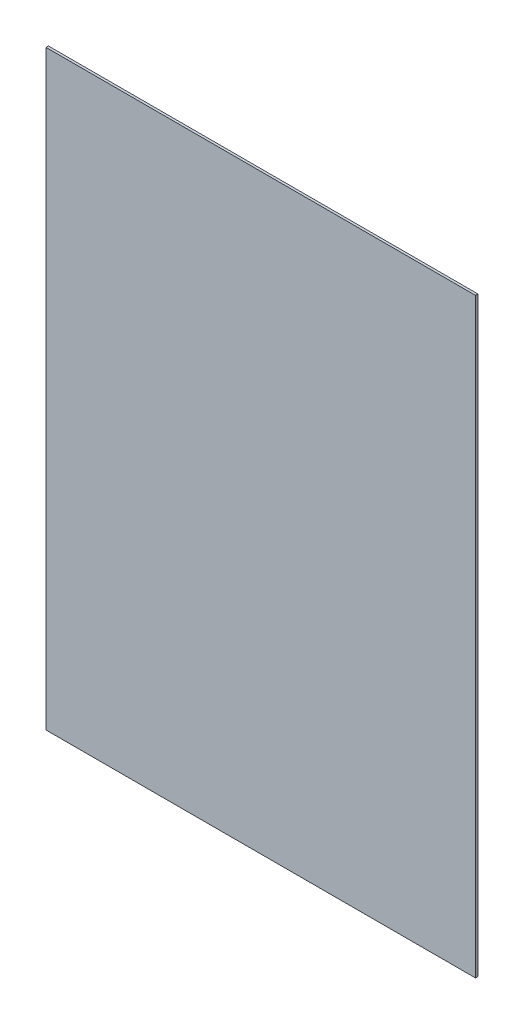
ISO-10303-21;
HEADER;
FILE_DESCRIPTION(('STEP AP214'),'2;1');
FILE_NAME('part.step','',(''),(''),'','','');
FILE_SCHEMA(('AUTOMOTIVE_DESIGN { 1 0 10303 214 1 1 1 1 }'));
ENDSEC;
DATA;
#1=APPLICATION_CONTEXT('core data for automotive mechanical design processes');
#2=APPLICATION_PROTOCOL_DEFINITION('international standard','automotive_design',2000,#1);
#3=PRODUCT_CONTEXT('',#1,'mechanical');
#4=PRODUCT('Part','Part','',(#3));
#5=PRODUCT_RELATED_PRODUCT_CATEGORY('part','',(#4));
#6=PRODUCT_DEFINITION_FORMATION('','',#4);
#7=PRODUCT_DEFINITION_CONTEXT('part definition',#1,'design');
#8=PRODUCT_DEFINITION('design','',#6,#7);
#9=PRODUCT_DEFINITION_SHAPE('','',#8);
#10=(LENGTH_UNIT() NAMED_UNIT(*) SI_UNIT(.MILLI.,.METRE.));
#11=(NAMED_UNIT(*) PLANE_ANGLE_UNIT() SI_UNIT($,.RADIAN.));
#12=(NAMED_UNIT(*) SI_UNIT($,.STERADIAN.) SOLID_ANGLE_UNIT());
#13=UNCERTAINTY_MEASURE_WITH_UNIT(LENGTH_MEASURE(1.E-05),#10,'distance_accuracy_value','');
#14=(GEOMETRIC_REPRESENTATION_CONTEXT(3) GLOBAL_UNCERTAINTY_ASSIGNED_CONTEXT((#13)) GLOBAL_UNIT_ASSIGNED_CONTEXT((#10,
#11,#12)) REPRESENTATION_CONTEXT('',''));
#15=CARTESIAN_POINT('',(0.,0.,0.));
#16=DIRECTION('',(0.,0.,1.));
#17=DIRECTION('',(1.,0.,0.));
#18=AXIS2_PLACEMENT_3D('',#15,#16,#17);
#19=CARTESIAN_POINT('',(134.9375,185.7375,7.74699999999995));
#20=DIRECTION('',(0.,0.,-1.));
#21=DIRECTION('',(-1.,0.,0.));
#22=AXIS2_PLACEMENT_3D('',#19,#20,#21);
#23=PLANE('',#22);
#24=DIRECTION('',(1.,0.,0.));
#25=VECTOR('',#24,1.);
#26=CARTESIAN_POINT('',(-134.9375,-185.7375,7.74699999999995));
#27=LINE('',#26,#25);
#28=CARTESIAN_POINT('',(-134.9375,-185.7375,7.74699999999995));
#29=VERTEX_POINT('',#28);
#30=CARTESIAN_POINT('',(134.9375,-185.7375,7.74699999999995));
#31=VERTEX_POINT('',#30);
#32=EDGE_CURVE('E59',#29,#31,#27,.T.);
#33=ORIENTED_EDGE('',*,*,#32,.F.);
#34=DIRECTION('',(0.,-1.,0.));
#35=VECTOR('',#34,1.);
#36=CARTESIAN_POINT('',(-134.9375,185.7375,7.74699999999995));
#37=LINE('',#36,#35);
#38=CARTESIAN_POINT('',(-134.9375,185.7375,7.74699999999995));
#39=VERTEX_POINT('',#38);
#40=EDGE_CURVE('E54',#39,#29,#37,.T.);
#41=ORIENTED_EDGE('',*,*,#40,.F.);
#42=DIRECTION('',(1.,0.,0.));
#43=VECTOR('',#42,1.);
#44=CARTESIAN_POINT('',(-134.9375,185.7375,7.74699999999995));
#45=LINE('',#44,#43);
#46=CARTESIAN_POINT('',(134.9375,185.7375,7.74699999999995));
#47=VERTEX_POINT('',#46);
#48=EDGE_CURVE('E70',#47,#39,#45,.F.);
#49=ORIENTED_EDGE('',*,*,#48,.F.);
#50=DIRECTION('',(0.,1.,0.));
#51=VECTOR('',#50,1.);
#52=CARTESIAN_POINT('',(134.9375,185.7375,7.74699999999995));
#53=LINE('',#52,#51);
#54=EDGE_CURVE('E20',#31,#47,#53,.T.);
#55=ORIENTED_EDGE('',*,*,#54,.F.);
#56=EDGE_LOOP('',(#33,#41,#49,#55));
#57=FACE_BOUND('',#56,.T.);
#58=ADVANCED_FACE('F17',(#57),#23,.T.);
#59=CARTESIAN_POINT('',(134.9375,185.7375,7.74699999999995));
#60=DIRECTION('',(1.,0.,0.));
#61=DIRECTION('',(0.,1.,0.));
#62=AXIS2_PLACEMENT_3D('',#59,#60,#61);
#63=PLANE('',#62);
#64=ORIENTED_EDGE('',*,*,#54,.T.);
#65=DIRECTION('',(0.,0.,1.));
#66=VECTOR('',#65,1.);
#67=CARTESIAN_POINT('',(134.9375,185.7375,7.74699999999995));
#68=LINE('',#67,#66);
#69=CARTESIAN_POINT('',(134.9375,185.7375,9.27099999999995));
#70=VERTEX_POINT('',#69);
#71=EDGE_CURVE('E87',#70,#47,#68,.F.);
#72=ORIENTED_EDGE('',*,*,#71,.F.);
#73=DIRECTION('',(0.,1.,0.));
#74=VECTOR('',#73,1.);
#75=CARTESIAN_POINT('',(134.9375,185.7375,9.27099999999995));
#76=LINE('',#75,#74);
#77=CARTESIAN_POINT('',(134.9375,-185.7375,9.27099999999995));
#78=VERTEX_POINT('',#77);
#79=EDGE_CURVE('E77',#70,#78,#76,.F.);
#80=ORIENTED_EDGE('',*,*,#79,.T.);
#81=DIRECTION('',(0.,0.,-1.));
#82=VECTOR('',#81,1.);
#83=CARTESIAN_POINT('',(134.9375,-185.7375,7.74699999999995));
#84=LINE('',#83,#82);
#85=EDGE_CURVE('E64',#31,#78,#84,.F.);
#86=ORIENTED_EDGE('',*,*,#85,.F.);
#87=EDGE_LOOP('',(#64,#72,#80,#86));
#88=FACE_BOUND('',#87,.T.);
#89=ADVANCED_FACE('F76',(#88),#63,.T.);
#90=CARTESIAN_POINT('',(-134.9375,-185.7375,7.74699999999995));
#91=DIRECTION('',(0.,-1.,0.));
#92=DIRECTION('',(0.,0.,-1.));
#93=AXIS2_PLACEMENT_3D('',#90,#91,#92);
#94=PLANE('',#93);
#95=ORIENTED_EDGE('',*,*,#32,.T.);
#96=ORIENTED_EDGE('',*,*,#85,.T.);
#97=DIRECTION('',(-1.,0.,0.));
#98=VECTOR('',#97,1.);
#99=CARTESIAN_POINT('',(134.9375,-185.7375,9.27099999999995));
#100=LINE('',#99,#98);
#101=CARTESIAN_POINT('',(-134.9375,-185.7375,9.27099999999995));
#102=VERTEX_POINT('',#101);
#103=EDGE_CURVE('E95',#78,#102,#100,.T.);
#104=ORIENTED_EDGE('',*,*,#103,.T.);
#105=DIRECTION('',(0.,0.,1.));
#106=VECTOR('',#105,1.);
#107=CARTESIAN_POINT('',(-134.9375,-185.7375,7.74699999999995));
#108=LINE('',#107,#106);
#109=EDGE_CURVE('E66',#29,#102,#108,.T.);
#110=ORIENTED_EDGE('',*,*,#109,.F.);
#111=EDGE_LOOP('',(#95,#96,#104,#110));
#112=FACE_BOUND('',#111,.T.);
#113=ADVANCED_FACE('F61',(#112),#94,.T.);
#114=CARTESIAN_POINT('',(-134.9375,185.7375,7.74699999999995));
#115=DIRECTION('',(-1.,0.,0.));
#116=DIRECTION('',(0.,-1.,0.));
#117=AXIS2_PLACEMENT_3D('',#114,#115,#116);
#118=PLANE('',#117);
#119=ORIENTED_EDGE('',*,*,#40,.T.);
#120=ORIENTED_EDGE('',*,*,#109,.T.);
#121=DIRECTION('',(0.,1.,0.));
#122=VECTOR('',#121,1.);
#123=CARTESIAN_POINT('',(-134.9375,185.7375,9.27099999999995));
#124=LINE('',#123,#122);
#125=CARTESIAN_POINT('',(-134.9375,185.7375,9.27099999999995));
#126=VERTEX_POINT('',#125);
#127=EDGE_CURVE('E27',#102,#126,#124,.T.);
#128=ORIENTED_EDGE('',*,*,#127,.T.);
#129=DIRECTION('',(0.,0.,1.));
#130=VECTOR('',#129,1.);
#131=CARTESIAN_POINT('',(-134.9375,185.7375,7.74699999999995));
#132=LINE('',#131,#130);
#133=EDGE_CURVE('E35',#39,#126,#132,.T.);
#134=ORIENTED_EDGE('',*,*,#133,.F.);
#135=EDGE_LOOP('',(#119,#120,#128,#134));
#136=FACE_BOUND('',#135,.T.);
#137=ADVANCED_FACE('F101',(#136),#118,.T.);
#138=CARTESIAN_POINT('',(-134.9375,185.7375,7.74699999999995));
#139=DIRECTION('',(0.,1.,0.));
#140=DIRECTION('',(0.,0.,1.));
#141=AXIS2_PLACEMENT_3D('',#138,#139,#140);
#142=PLANE('',#141);
#143=ORIENTED_EDGE('',*,*,#48,.T.);
#144=ORIENTED_EDGE('',*,*,#133,.T.);
#145=DIRECTION('',(-1.,0.,0.));
#146=VECTOR('',#145,1.);
#147=CARTESIAN_POINT('',(134.9375,185.7375,9.27099999999995));
#148=LINE('',#147,#146);
#149=EDGE_CURVE('E11',#126,#70,#148,.F.);
#150=ORIENTED_EDGE('',*,*,#149,.T.);
#151=ORIENTED_EDGE('',*,*,#71,.T.);
#152=EDGE_LOOP('',(#143,#144,#150,#151));
#153=FACE_BOUND('',#152,.T.);
#154=ADVANCED_FACE('F104',(#153),#142,.T.);
#155=CARTESIAN_POINT('',(134.9375,185.7375,9.27099999999995));
#156=DIRECTION('',(0.,0.,-1.));
#157=DIRECTION('',(-1.,0.,0.));
#158=AXIS2_PLACEMENT_3D('',#155,#156,#157);
#159=PLANE('',#158);
#160=ORIENTED_EDGE('',*,*,#127,.F.);
#161=ORIENTED_EDGE('',*,*,#103,.F.);
#162=ORIENTED_EDGE('',*,*,#79,.F.);
#163=ORIENTED_EDGE('',*,*,#149,.F.);
#164=EDGE_LOOP('',(#160,#161,#162,#163));
#165=FACE_BOUND('',#164,.T.);
#166=ADVANCED_FACE('F103',(#165),#159,.F.);
#167=CLOSED_SHELL('',(#58,#89,#113,#137,#154,#166));
#168=MANIFOLD_SOLID_BREP('B1',#167);
#169=ADVANCED_BREP_SHAPE_REPRESENTATION('',(#18,#168),#14);
#170=SHAPE_DEFINITION_REPRESENTATION(#9,#169);
ENDSEC;
END-ISO-10303-21;
